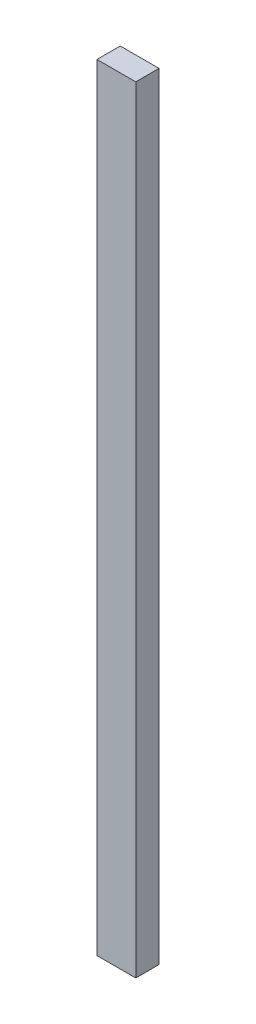
ISO-10303-21;
HEADER;
FILE_DESCRIPTION(('STEP AP214'),'2;1');
FILE_NAME('part.step','',(''),(''),'','','');
FILE_SCHEMA(('AUTOMOTIVE_DESIGN { 1 0 10303 214 1 1 1 1 }'));
ENDSEC;
DATA;
#1=APPLICATION_CONTEXT('core data for automotive mechanical design processes');
#2=APPLICATION_PROTOCOL_DEFINITION('international standard','automotive_design',2000,#1);
#3=PRODUCT_CONTEXT('',#1,'mechanical');
#4=PRODUCT('Part','Part','',(#3));
#5=PRODUCT_RELATED_PRODUCT_CATEGORY('part','',(#4));
#6=PRODUCT_DEFINITION_FORMATION('','',#4);
#7=PRODUCT_DEFINITION_CONTEXT('part definition',#1,'design');
#8=PRODUCT_DEFINITION('design','',#6,#7);
#9=PRODUCT_DEFINITION_SHAPE('','',#8);
#10=(LENGTH_UNIT() NAMED_UNIT(*) SI_UNIT(.MILLI.,.METRE.));
#11=(NAMED_UNIT(*) PLANE_ANGLE_UNIT() SI_UNIT($,.RADIAN.));
#12=(NAMED_UNIT(*) SI_UNIT($,.STERADIAN.) SOLID_ANGLE_UNIT());
#13=UNCERTAINTY_MEASURE_WITH_UNIT(LENGTH_MEASURE(1.E-05),#10,'distance_accuracy_value','');
#14=(GEOMETRIC_REPRESENTATION_CONTEXT(3) GLOBAL_UNCERTAINTY_ASSIGNED_CONTEXT((#13)) GLOBAL_UNIT_ASSIGNED_CONTEXT((#10,
#11,#12)) REPRESENTATION_CONTEXT('',''));
#15=CARTESIAN_POINT('',(0.,0.,0.));
#16=DIRECTION('',(0.,0.,1.));
#17=DIRECTION('',(1.,0.,0.));
#18=AXIS2_PLACEMENT_3D('',#15,#16,#17);
#19=CARTESIAN_POINT('',(2.5,100.,1.5));
#20=DIRECTION('',(-1.,0.,0.));
#21=DIRECTION('',(0.,0.,1.));
#22=AXIS2_PLACEMENT_3D('',#19,#20,#21);
#23=PLANE('',#22);
#24=DIRECTION('',(0.,0.,-1.));
#25=VECTOR('',#24,1.);
#26=CARTESIAN_POINT('',(2.5,0.,1.5));
#27=LINE('',#26,#25);
#28=CARTESIAN_POINT('',(2.5,0.,1.5));
#29=VERTEX_POINT('',#28);
#30=CARTESIAN_POINT('',(2.5,0.,-1.5));
#31=VERTEX_POINT('',#30);
#32=EDGE_CURVE('E97',#29,#31,#27,.T.);
#33=ORIENTED_EDGE('',*,*,#32,.T.);
#34=DIRECTION('',(0.,-1.,0.));
#35=VECTOR('',#34,1.);
#36=CARTESIAN_POINT('',(2.5,100.,-1.5));
#37=LINE('',#36,#35);
#38=CARTESIAN_POINT('',(2.5,100.,-1.5));
#39=VERTEX_POINT('',#38);
#40=EDGE_CURVE('E11',#39,#31,#37,.T.);
#41=ORIENTED_EDGE('',*,*,#40,.F.);
#42=DIRECTION('',(0.,0.,-1.));
#43=VECTOR('',#42,1.);
#44=CARTESIAN_POINT('',(2.5,100.,1.5));
#45=LINE('',#44,#43);
#46=CARTESIAN_POINT('',(2.5,100.,1.5));
#47=VERTEX_POINT('',#46);
#48=EDGE_CURVE('E85',#47,#39,#45,.T.);
#49=ORIENTED_EDGE('',*,*,#48,.F.);
#50=DIRECTION('',(0.,-1.,0.));
#51=VECTOR('',#50,1.);
#52=CARTESIAN_POINT('',(2.5,100.,1.5));
#53=LINE('',#52,#51);
#54=EDGE_CURVE('E93',#47,#29,#53,.T.);
#55=ORIENTED_EDGE('',*,*,#54,.T.);
#56=EDGE_LOOP('',(#33,#41,#49,#55));
#57=FACE_BOUND('',#56,.T.);
#58=ADVANCED_FACE('F34',(#57),#23,.F.);
#59=CARTESIAN_POINT('',(-2.5,100.,-1.5));
#60=DIRECTION('',(0.,0.,1.));
#61=DIRECTION('',(1.,0.,0.));
#62=AXIS2_PLACEMENT_3D('',#59,#60,#61);
#63=PLANE('',#62);
#64=DIRECTION('',(-1.,0.,0.));
#65=VECTOR('',#64,1.);
#66=CARTESIAN_POINT('',(-2.5,0.,-1.5));
#67=LINE('',#66,#65);
#68=CARTESIAN_POINT('',(-2.5,0.,-1.5));
#69=VERTEX_POINT('',#68);
#70=EDGE_CURVE('E89',#31,#69,#67,.T.);
#71=ORIENTED_EDGE('',*,*,#70,.T.);
#72=DIRECTION('',(0.,-1.,0.));
#73=VECTOR('',#72,1.);
#74=CARTESIAN_POINT('',(-2.5,100.,-1.5));
#75=LINE('',#74,#73);
#76=CARTESIAN_POINT('',(-2.5,100.,-1.5));
#77=VERTEX_POINT('',#76);
#78=EDGE_CURVE('E42',#77,#69,#75,.T.);
#79=ORIENTED_EDGE('',*,*,#78,.F.);
#80=DIRECTION('',(-1.,0.,0.));
#81=VECTOR('',#80,1.);
#82=CARTESIAN_POINT('',(-2.5,100.,-1.5));
#83=LINE('',#82,#81);
#84=EDGE_CURVE('E80',#39,#77,#83,.T.);
#85=ORIENTED_EDGE('',*,*,#84,.F.);
#86=ORIENTED_EDGE('',*,*,#40,.T.);
#87=EDGE_LOOP('',(#71,#79,#85,#86));
#88=FACE_BOUND('',#87,.T.);
#89=ADVANCED_FACE('F88',(#88),#63,.F.);
#90=CARTESIAN_POINT('',(-2.5,100.,1.5));
#91=DIRECTION('',(1.,0.,0.));
#92=DIRECTION('',(0.,0.,-1.));
#93=AXIS2_PLACEMENT_3D('',#90,#91,#92);
#94=PLANE('',#93);
#95=DIRECTION('',(0.,0.,1.));
#96=VECTOR('',#95,1.);
#97=CARTESIAN_POINT('',(-2.5,0.,1.5));
#98=LINE('',#97,#96);
#99=CARTESIAN_POINT('',(-2.5,0.,1.5));
#100=VERTEX_POINT('',#99);
#101=EDGE_CURVE('E67',#69,#100,#98,.T.);
#102=ORIENTED_EDGE('',*,*,#101,.T.);
#103=DIRECTION('',(0.,-1.,0.));
#104=VECTOR('',#103,1.);
#105=CARTESIAN_POINT('',(-2.5,100.,1.5));
#106=LINE('',#105,#104);
#107=CARTESIAN_POINT('',(-2.5,100.,1.5));
#108=VERTEX_POINT('',#107);
#109=EDGE_CURVE('E90',#108,#100,#106,.T.);
#110=ORIENTED_EDGE('',*,*,#109,.F.);
#111=DIRECTION('',(0.,0.,1.));
#112=VECTOR('',#111,1.);
#113=CARTESIAN_POINT('',(-2.5,100.,1.5));
#114=LINE('',#113,#112);
#115=EDGE_CURVE('E83',#77,#108,#114,.T.);
#116=ORIENTED_EDGE('',*,*,#115,.F.);
#117=ORIENTED_EDGE('',*,*,#78,.T.);
#118=EDGE_LOOP('',(#102,#110,#116,#117));
#119=FACE_BOUND('',#118,.T.);
#120=ADVANCED_FACE('F91',(#119),#94,.F.);
#121=CARTESIAN_POINT('',(-2.5,100.,1.5));
#122=DIRECTION('',(0.,0.,-1.));
#123=DIRECTION('',(-1.,0.,0.));
#124=AXIS2_PLACEMENT_3D('',#121,#122,#123);
#125=PLANE('',#124);
#126=DIRECTION('',(1.,0.,0.));
#127=VECTOR('',#126,1.);
#128=CARTESIAN_POINT('',(-2.5,0.,1.5));
#129=LINE('',#128,#127);
#130=EDGE_CURVE('E73',#100,#29,#129,.T.);
#131=ORIENTED_EDGE('',*,*,#130,.T.);
#132=ORIENTED_EDGE('',*,*,#54,.F.);
#133=DIRECTION('',(1.,0.,0.));
#134=VECTOR('',#133,1.);
#135=CARTESIAN_POINT('',(-2.5,100.,1.5));
#136=LINE('',#135,#134);
#137=EDGE_CURVE('E50',#108,#47,#136,.T.);
#138=ORIENTED_EDGE('',*,*,#137,.F.);
#139=ORIENTED_EDGE('',*,*,#109,.T.);
#140=EDGE_LOOP('',(#131,#132,#138,#139));
#141=FACE_BOUND('',#140,.T.);
#142=ADVANCED_FACE('F104',(#141),#125,.F.);
#143=CARTESIAN_POINT('',(0.,100.,0.));
#144=DIRECTION('',(0.,-1.,0.));
#145=DIRECTION('',(0.,0.,-1.));
#146=AXIS2_PLACEMENT_3D('',#143,#144,#145);
#147=PLANE('',#146);
#148=ORIENTED_EDGE('',*,*,#48,.T.);
#149=ORIENTED_EDGE('',*,*,#84,.T.);
#150=ORIENTED_EDGE('',*,*,#115,.T.);
#151=ORIENTED_EDGE('',*,*,#137,.T.);
#152=EDGE_LOOP('',(#148,#149,#150,#151));
#153=FACE_BOUND('',#152,.T.);
#154=ADVANCED_FACE('F81',(#153),#147,.F.);
#155=CARTESIAN_POINT('',(0.,0.,0.));
#156=DIRECTION('',(0.,-1.,0.));
#157=DIRECTION('',(0.,0.,-1.));
#158=AXIS2_PLACEMENT_3D('',#155,#156,#157);
#159=PLANE('',#158);
#160=ORIENTED_EDGE('',*,*,#32,.F.);
#161=ORIENTED_EDGE('',*,*,#130,.F.);
#162=ORIENTED_EDGE('',*,*,#101,.F.);
#163=ORIENTED_EDGE('',*,*,#70,.F.);
#164=EDGE_LOOP('',(#160,#161,#162,#163));
#165=FACE_BOUND('',#164,.T.);
#166=ADVANCED_FACE('F107',(#165),#159,.T.);
#167=CLOSED_SHELL('',(#58,#89,#120,#142,#154,#166));
#168=MANIFOLD_SOLID_BREP('B2',#167);
#169=ADVANCED_BREP_SHAPE_REPRESENTATION('',(#18,#168),#14);
#170=SHAPE_DEFINITION_REPRESENTATION(#9,#169);
ENDSEC;
END-ISO-10303-21;
